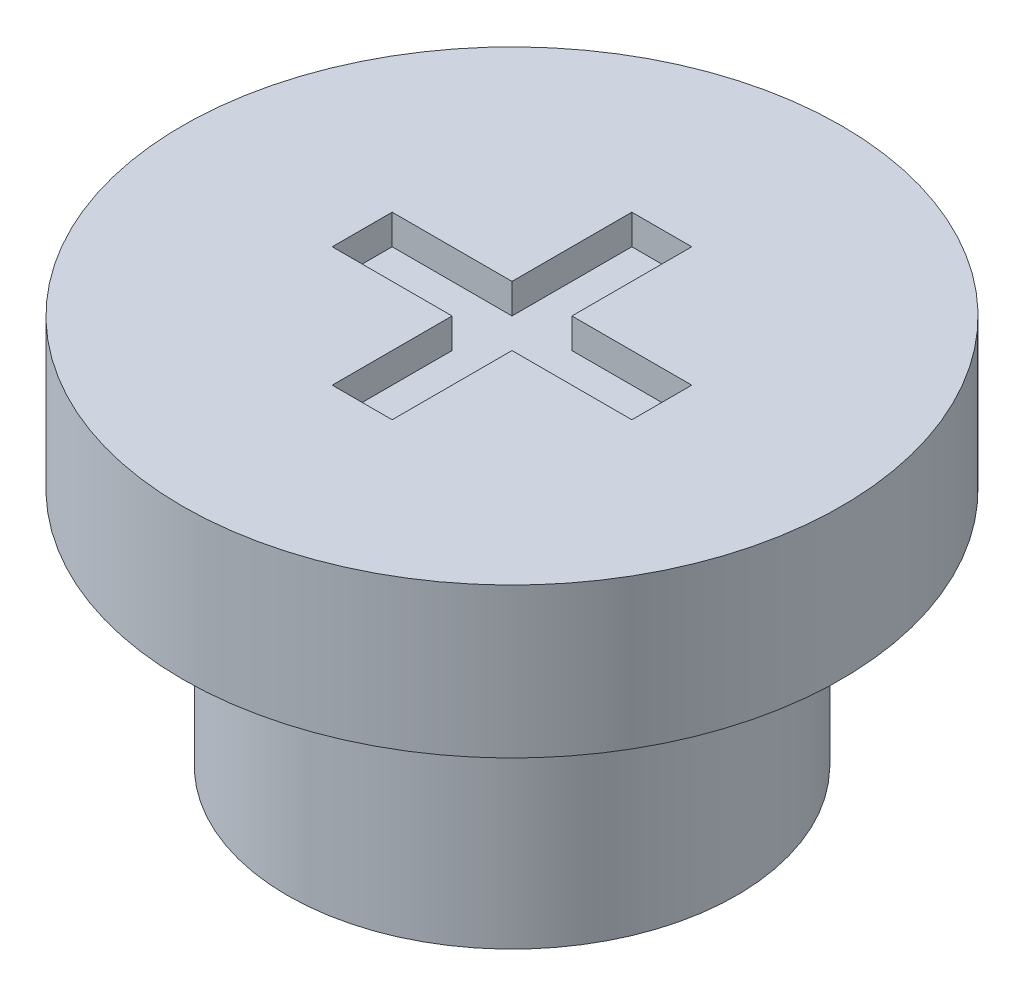
ISO-10303-21;
HEADER;
FILE_DESCRIPTION(('STEP AP214'),'2;1');
FILE_NAME('part.step','',(''),(''),'','','');
FILE_SCHEMA(('AUTOMOTIVE_DESIGN { 1 0 10303 214 1 1 1 1 }'));
ENDSEC;
DATA;
#1=APPLICATION_CONTEXT('core data for automotive mechanical design processes');
#2=APPLICATION_PROTOCOL_DEFINITION('international standard','automotive_design',2000,#1);
#3=PRODUCT_CONTEXT('',#1,'mechanical');
#4=PRODUCT('Part','Part','',(#3));
#5=PRODUCT_RELATED_PRODUCT_CATEGORY('part','',(#4));
#6=PRODUCT_DEFINITION_FORMATION('','',#4);
#7=PRODUCT_DEFINITION_CONTEXT('part definition',#1,'design');
#8=PRODUCT_DEFINITION('design','',#6,#7);
#9=PRODUCT_DEFINITION_SHAPE('','',#8);
#10=(LENGTH_UNIT() NAMED_UNIT(*) SI_UNIT(.MILLI.,.METRE.));
#11=(NAMED_UNIT(*) PLANE_ANGLE_UNIT() SI_UNIT($,.RADIAN.));
#12=(NAMED_UNIT(*) SI_UNIT($,.STERADIAN.) SOLID_ANGLE_UNIT());
#13=UNCERTAINTY_MEASURE_WITH_UNIT(LENGTH_MEASURE(1.E-05),#10,'distance_accuracy_value','');
#14=(GEOMETRIC_REPRESENTATION_CONTEXT(3) GLOBAL_UNCERTAINTY_ASSIGNED_CONTEXT((#13)) GLOBAL_UNIT_ASSIGNED_CONTEXT((#10,
#11,#12)) REPRESENTATION_CONTEXT('',''));
#15=CARTESIAN_POINT('',(0.,0.,0.));
#16=DIRECTION('',(0.,0.,1.));
#17=DIRECTION('',(1.,0.,0.));
#18=AXIS2_PLACEMENT_3D('',#15,#16,#17);
#19=CARTESIAN_POINT('',(0.,0.8,0.));
#20=DIRECTION('',(0.,-1.,0.));
#21=DIRECTION('',(0.,0.,-1.));
#22=AXIS2_PLACEMENT_3D('',#19,#20,#21);
#23=CYLINDRICAL_SURFACE('',#22,0.75);
#24=CARTESIAN_POINT('',(0.,0.8,0.));
#25=DIRECTION('',(0.,1.,0.));
#26=DIRECTION('',(0.,0.,1.));
#27=AXIS2_PLACEMENT_3D('',#24,#25,#26);
#28=CIRCLE('',#27,0.75);
#29=CARTESIAN_POINT('',(0.,0.8,0.75));
#30=VERTEX_POINT('',#29);
#31=EDGE_CURVE('E11',#30,#30,#28,.T.);
#32=ORIENTED_EDGE('',*,*,#31,.F.);
#33=EDGE_LOOP('',(#32));
#34=FACE_BOUND('',#33,.T.);
#35=CARTESIAN_POINT('',(0.,0.,0.));
#36=DIRECTION('',(0.,1.,0.));
#37=DIRECTION('',(0.,0.,1.));
#38=AXIS2_PLACEMENT_3D('',#35,#36,#37);
#39=CIRCLE('',#38,0.75);
#40=CARTESIAN_POINT('',(0.,0.,0.75));
#41=VERTEX_POINT('',#40);
#42=EDGE_CURVE('E45',#41,#41,#39,.T.);
#43=ORIENTED_EDGE('',*,*,#42,.T.);
#44=EDGE_LOOP('',(#43));
#45=FACE_BOUND('',#44,.T.);
#46=ADVANCED_FACE('F39',(#34,#45),#23,.T.);
#47=CARTESIAN_POINT('',(0.,0.,0.));
#48=DIRECTION('',(0.,1.,0.));
#49=DIRECTION('',(0.,0.,1.));
#50=AXIS2_PLACEMENT_3D('',#47,#48,#49);
#51=PLANE('',#50);
#52=ORIENTED_EDGE('',*,*,#42,.F.);
#53=EDGE_LOOP('',(#52));
#54=FACE_BOUND('',#53,.T.);
#55=ADVANCED_FACE('F240',(#54),#51,.F.);
#56=CARTESIAN_POINT('',(0.,1.3,0.));
#57=DIRECTION('',(0.,-1.,0.));
#58=DIRECTION('',(0.,0.,-1.));
#59=AXIS2_PLACEMENT_3D('',#56,#57,#58);
#60=CYLINDRICAL_SURFACE('',#59,1.1);
#61=CARTESIAN_POINT('',(0.,1.3,0.));
#62=DIRECTION('',(0.,1.,0.));
#63=DIRECTION('',(0.,0.,1.));
#64=AXIS2_PLACEMENT_3D('',#61,#62,#63);
#65=CIRCLE('',#64,1.1);
#66=CARTESIAN_POINT('',(0.,1.3,1.1));
#67=VERTEX_POINT('',#66);
#68=EDGE_CURVE('E215',#67,#67,#65,.T.);
#69=ORIENTED_EDGE('',*,*,#68,.F.);
#70=EDGE_LOOP('',(#69));
#71=FACE_BOUND('',#70,.T.);
#72=CARTESIAN_POINT('',(0.,0.8,0.));
#73=DIRECTION('',(0.,1.,0.));
#74=DIRECTION('',(0.,0.,1.));
#75=AXIS2_PLACEMENT_3D('',#72,#73,#74);
#76=CIRCLE('',#75,1.1);
#77=CARTESIAN_POINT('',(0.,0.8,1.1));
#78=VERTEX_POINT('',#77);
#79=EDGE_CURVE('E191',#78,#78,#76,.T.);
#80=ORIENTED_EDGE('',*,*,#79,.T.);
#81=EDGE_LOOP('',(#80));
#82=FACE_BOUND('',#81,.T.);
#83=ADVANCED_FACE('F217',(#71,#82),#60,.T.);
#84=CARTESIAN_POINT('',(0.,1.3,0.));
#85=DIRECTION('',(0.,1.,0.));
#86=DIRECTION('',(0.,0.,1.));
#87=AXIS2_PLACEMENT_3D('',#84,#85,#86);
#88=PLANE('',#87);
#89=DIRECTION('',(0.,0.,1.));
#90=VECTOR('',#89,1.);
#91=CARTESIAN_POINT('',(-0.5,1.3,-0.1));
#92=LINE('',#91,#90);
#93=CARTESIAN_POINT('',(-0.5,1.3,-0.1));
#94=VERTEX_POINT('',#93);
#95=CARTESIAN_POINT('',(-0.5,1.3,0.1));
#96=VERTEX_POINT('',#95);
#97=EDGE_CURVE('E52',#94,#96,#92,.T.);
#98=ORIENTED_EDGE('',*,*,#97,.F.);
#99=DIRECTION('',(-1.,0.,0.));
#100=VECTOR('',#99,1.);
#101=CARTESIAN_POINT('',(-0.5,1.3,-0.1));
#102=LINE('',#101,#100);
#103=CARTESIAN_POINT('',(-0.1,1.3,-0.1));
#104=VERTEX_POINT('',#103);
#105=EDGE_CURVE('E189',#104,#94,#102,.T.);
#106=ORIENTED_EDGE('',*,*,#105,.F.);
#107=DIRECTION('',(0.,0.,1.));
#108=VECTOR('',#107,1.);
#109=CARTESIAN_POINT('',(-0.1,1.3,-0.5));
#110=LINE('',#109,#108);
#111=CARTESIAN_POINT('',(-0.1,1.3,-0.5));
#112=VERTEX_POINT('',#111);
#113=EDGE_CURVE('E187',#112,#104,#110,.T.);
#114=ORIENTED_EDGE('',*,*,#113,.F.);
#115=DIRECTION('',(-1.,0.,0.));
#116=VECTOR('',#115,1.);
#117=CARTESIAN_POINT('',(-0.1,1.3,-0.5));
#118=LINE('',#117,#116);
#119=CARTESIAN_POINT('',(0.0999999999999999,1.3,-0.5));
#120=VERTEX_POINT('',#119);
#121=EDGE_CURVE('E139',#120,#112,#118,.T.);
#122=ORIENTED_EDGE('',*,*,#121,.F.);
#123=DIRECTION('',(0.,0.,-1.));
#124=VECTOR('',#123,1.);
#125=CARTESIAN_POINT('',(0.0999999999999999,1.3,-0.5));
#126=LINE('',#125,#124);
#127=CARTESIAN_POINT('',(0.1,1.3,-0.1));
#128=VERTEX_POINT('',#127);
#129=EDGE_CURVE('E184',#128,#120,#126,.T.);
#130=ORIENTED_EDGE('',*,*,#129,.F.);
#131=DIRECTION('',(-1.,0.,0.));
#132=VECTOR('',#131,1.);
#133=CARTESIAN_POINT('',(0.1,1.3,-0.1));
#134=LINE('',#133,#132);
#135=CARTESIAN_POINT('',(0.5,1.3,-0.1));
#136=VERTEX_POINT('',#135);
#137=EDGE_CURVE('E182',#136,#128,#134,.T.);
#138=ORIENTED_EDGE('',*,*,#137,.F.);
#139=DIRECTION('',(0.,0.,-1.));
#140=VECTOR('',#139,1.);
#141=CARTESIAN_POINT('',(0.5,1.3,-0.1));
#142=LINE('',#141,#140);
#143=CARTESIAN_POINT('',(0.5,1.3,0.1));
#144=VERTEX_POINT('',#143);
#145=EDGE_CURVE('E180',#144,#136,#142,.T.);
#146=ORIENTED_EDGE('',*,*,#145,.F.);
#147=DIRECTION('',(1.,0.,0.));
#148=VECTOR('',#147,1.);
#149=CARTESIAN_POINT('',(0.1,1.3,0.1));
#150=LINE('',#149,#148);
#151=CARTESIAN_POINT('',(0.1,1.3,0.1));
#152=VERTEX_POINT('',#151);
#153=EDGE_CURVE('E174',#152,#144,#150,.T.);
#154=ORIENTED_EDGE('',*,*,#153,.F.);
#155=DIRECTION('',(0.,0.,-1.));
#156=VECTOR('',#155,1.);
#157=CARTESIAN_POINT('',(0.1,1.3,0.1));
#158=LINE('',#157,#156);
#159=CARTESIAN_POINT('',(0.1,1.3,0.5));
#160=VERTEX_POINT('',#159);
#161=EDGE_CURVE('E175',#160,#152,#158,.T.);
#162=ORIENTED_EDGE('',*,*,#161,.F.);
#163=DIRECTION('',(1.,0.,0.));
#164=VECTOR('',#163,1.);
#165=CARTESIAN_POINT('',(-0.1,1.3,0.5));
#166=LINE('',#165,#164);
#167=CARTESIAN_POINT('',(-0.1,1.3,0.5));
#168=VERTEX_POINT('',#167);
#169=EDGE_CURVE('E166',#168,#160,#166,.T.);
#170=ORIENTED_EDGE('',*,*,#169,.F.);
#171=DIRECTION('',(0.,0.,1.));
#172=VECTOR('',#171,1.);
#173=CARTESIAN_POINT('',(-0.1,1.3,0.1));
#174=LINE('',#173,#172);
#175=CARTESIAN_POINT('',(-0.1,1.3,0.1));
#176=VERTEX_POINT('',#175);
#177=EDGE_CURVE('E167',#176,#168,#174,.T.);
#178=ORIENTED_EDGE('',*,*,#177,.F.);
#179=DIRECTION('',(1.,0.,0.));
#180=VECTOR('',#179,1.);
#181=CARTESIAN_POINT('',(-0.5,1.3,0.1));
#182=LINE('',#181,#180);
#183=EDGE_CURVE('E162',#96,#176,#182,.T.);
#184=ORIENTED_EDGE('',*,*,#183,.F.);
#185=EDGE_LOOP('',(#98,#106,#114,#122,#130,#138,#146,#154,#162,#170,#178,#184));
#186=FACE_BOUND('',#185,.T.);
#187=ORIENTED_EDGE('',*,*,#68,.T.);
#188=EDGE_LOOP('',(#187));
#189=FACE_BOUND('',#188,.T.);
#190=ADVANCED_FACE('F224',(#186,#189),#88,.T.);
#191=CARTESIAN_POINT('',(0.,0.8,0.));
#192=DIRECTION('',(0.,1.,0.));
#193=DIRECTION('',(0.,0.,1.));
#194=AXIS2_PLACEMENT_3D('',#191,#192,#193);
#195=PLANE('',#194);
#196=ORIENTED_EDGE('',*,*,#31,.T.);
#197=EDGE_LOOP('',(#196));
#198=FACE_BOUND('',#197,.T.);
#199=ORIENTED_EDGE('',*,*,#79,.F.);
#200=EDGE_LOOP('',(#199));
#201=FACE_BOUND('',#200,.T.);
#202=ADVANCED_FACE('F219',(#198,#201),#195,.F.);
#203=CARTESIAN_POINT('',(-0.5,1.2,-0.1));
#204=DIRECTION('',(-1.,0.,0.));
#205=DIRECTION('',(0.,0.,1.));
#206=AXIS2_PLACEMENT_3D('',#203,#204,#205);
#207=PLANE('',#206);
#208=ORIENTED_EDGE('',*,*,#97,.T.);
#209=DIRECTION('',(0.,1.,0.));
#210=VECTOR('',#209,1.);
#211=CARTESIAN_POINT('',(-0.5,1.2,0.1));
#212=LINE('',#211,#210);
#213=CARTESIAN_POINT('',(-0.5,1.2,0.1));
#214=VERTEX_POINT('',#213);
#215=EDGE_CURVE('E101',#214,#96,#212,.T.);
#216=ORIENTED_EDGE('',*,*,#215,.F.);
#217=DIRECTION('',(0.,0.,1.));
#218=VECTOR('',#217,1.);
#219=CARTESIAN_POINT('',(-0.5,1.2,-0.1));
#220=LINE('',#219,#218);
#221=CARTESIAN_POINT('',(-0.5,1.2,-0.1));
#222=VERTEX_POINT('',#221);
#223=EDGE_CURVE('E194',#222,#214,#220,.T.);
#224=ORIENTED_EDGE('',*,*,#223,.F.);
#225=DIRECTION('',(0.,1.,0.));
#226=VECTOR('',#225,1.);
#227=CARTESIAN_POINT('',(-0.5,1.2,-0.1));
#228=LINE('',#227,#226);
#229=EDGE_CURVE('E61',#222,#94,#228,.T.);
#230=ORIENTED_EDGE('',*,*,#229,.T.);
#231=EDGE_LOOP('',(#208,#216,#224,#230));
#232=FACE_BOUND('',#231,.T.);
#233=ADVANCED_FACE('F225',(#232),#207,.F.);
#234=CARTESIAN_POINT('',(-0.5,1.2,-0.1));
#235=DIRECTION('',(0.,0.,-1.));
#236=DIRECTION('',(-1.,0.,0.));
#237=AXIS2_PLACEMENT_3D('',#234,#235,#236);
#238=PLANE('',#237);
#239=ORIENTED_EDGE('',*,*,#105,.T.);
#240=ORIENTED_EDGE('',*,*,#229,.F.);
#241=DIRECTION('',(-1.,0.,0.));
#242=VECTOR('',#241,1.);
#243=CARTESIAN_POINT('',(-0.5,1.2,-0.1));
#244=LINE('',#243,#242);
#245=CARTESIAN_POINT('',(-0.1,1.2,-0.1));
#246=VERTEX_POINT('',#245);
#247=EDGE_CURVE('E149',#246,#222,#244,.T.);
#248=ORIENTED_EDGE('',*,*,#247,.F.);
#249=DIRECTION('',(0.,1.,0.));
#250=VECTOR('',#249,1.);
#251=CARTESIAN_POINT('',(-0.1,1.2,-0.1));
#252=LINE('',#251,#250);
#253=EDGE_CURVE('E143',#246,#104,#252,.T.);
#254=ORIENTED_EDGE('',*,*,#253,.T.);
#255=EDGE_LOOP('',(#239,#240,#248,#254));
#256=FACE_BOUND('',#255,.T.);
#257=ADVANCED_FACE('F232',(#256),#238,.F.);
#258=CARTESIAN_POINT('',(-0.1,1.2,-0.5));
#259=DIRECTION('',(-1.,0.,0.));
#260=DIRECTION('',(0.,0.,1.));
#261=AXIS2_PLACEMENT_3D('',#258,#259,#260);
#262=PLANE('',#261);
#263=ORIENTED_EDGE('',*,*,#113,.T.);
#264=ORIENTED_EDGE('',*,*,#253,.F.);
#265=DIRECTION('',(0.,0.,1.));
#266=VECTOR('',#265,1.);
#267=CARTESIAN_POINT('',(-0.1,1.2,-0.5));
#268=LINE('',#267,#266);
#269=CARTESIAN_POINT('',(-0.1,1.2,-0.5));
#270=VERTEX_POINT('',#269);
#271=EDGE_CURVE('E144',#270,#246,#268,.T.);
#272=ORIENTED_EDGE('',*,*,#271,.F.);
#273=DIRECTION('',(0.,1.,0.));
#274=VECTOR('',#273,1.);
#275=CARTESIAN_POINT('',(-0.1,1.2,-0.5));
#276=LINE('',#275,#274);
#277=EDGE_CURVE('E128',#270,#112,#276,.T.);
#278=ORIENTED_EDGE('',*,*,#277,.T.);
#279=EDGE_LOOP('',(#263,#264,#272,#278));
#280=FACE_BOUND('',#279,.T.);
#281=ADVANCED_FACE('F148',(#280),#262,.F.);
#282=CARTESIAN_POINT('',(-0.1,1.2,-0.5));
#283=DIRECTION('',(0.,0.,-1.));
#284=DIRECTION('',(-1.,0.,0.));
#285=AXIS2_PLACEMENT_3D('',#282,#283,#284);
#286=PLANE('',#285);
#287=ORIENTED_EDGE('',*,*,#121,.T.);
#288=ORIENTED_EDGE('',*,*,#277,.F.);
#289=DIRECTION('',(-1.,0.,0.));
#290=VECTOR('',#289,1.);
#291=CARTESIAN_POINT('',(-0.1,1.2,-0.5));
#292=LINE('',#291,#290);
#293=CARTESIAN_POINT('',(0.0999999999999999,1.2,-0.5));
#294=VERTEX_POINT('',#293);
#295=EDGE_CURVE('E133',#294,#270,#292,.T.);
#296=ORIENTED_EDGE('',*,*,#295,.F.);
#297=DIRECTION('',(0.,1.,0.));
#298=VECTOR('',#297,1.);
#299=CARTESIAN_POINT('',(0.0999999999999999,1.2,-0.5));
#300=LINE('',#299,#298);
#301=EDGE_CURVE('E142',#294,#120,#300,.T.);
#302=ORIENTED_EDGE('',*,*,#301,.T.);
#303=EDGE_LOOP('',(#287,#288,#296,#302));
#304=FACE_BOUND('',#303,.T.);
#305=ADVANCED_FACE('F135',(#304),#286,.F.);
#306=CARTESIAN_POINT('',(0.0999999999999999,1.2,-0.5));
#307=DIRECTION('',(1.,0.,0.));
#308=DIRECTION('',(0.,0.,-1.));
#309=AXIS2_PLACEMENT_3D('',#306,#307,#308);
#310=PLANE('',#309);
#311=ORIENTED_EDGE('',*,*,#129,.T.);
#312=ORIENTED_EDGE('',*,*,#301,.F.);
#313=DIRECTION('',(0.,0.,-1.));
#314=VECTOR('',#313,1.);
#315=CARTESIAN_POINT('',(0.0999999999999999,1.2,-0.5));
#316=LINE('',#315,#314);
#317=CARTESIAN_POINT('',(0.1,1.2,-0.1));
#318=VERTEX_POINT('',#317);
#319=EDGE_CURVE('E154',#318,#294,#316,.T.);
#320=ORIENTED_EDGE('',*,*,#319,.F.);
#321=DIRECTION('',(0.,1.,0.));
#322=VECTOR('',#321,1.);
#323=CARTESIAN_POINT('',(0.1,1.2,-0.1));
#324=LINE('',#323,#322);
#325=EDGE_CURVE('E197',#318,#128,#324,.T.);
#326=ORIENTED_EDGE('',*,*,#325,.T.);
#327=EDGE_LOOP('',(#311,#312,#320,#326));
#328=FACE_BOUND('',#327,.T.);
#329=ADVANCED_FACE('F298',(#328),#310,.F.);
#330=CARTESIAN_POINT('',(0.1,1.2,-0.1));
#331=DIRECTION('',(0.,0.,-1.));
#332=DIRECTION('',(-1.,0.,0.));
#333=AXIS2_PLACEMENT_3D('',#330,#331,#332);
#334=PLANE('',#333);
#335=ORIENTED_EDGE('',*,*,#137,.T.);
#336=ORIENTED_EDGE('',*,*,#325,.F.);
#337=DIRECTION('',(-1.,0.,0.));
#338=VECTOR('',#337,1.);
#339=CARTESIAN_POINT('',(0.1,1.2,-0.1));
#340=LINE('',#339,#338);
#341=CARTESIAN_POINT('',(0.5,1.2,-0.1));
#342=VERTEX_POINT('',#341);
#343=EDGE_CURVE('E160',#342,#318,#340,.T.);
#344=ORIENTED_EDGE('',*,*,#343,.F.);
#345=DIRECTION('',(0.,1.,0.));
#346=VECTOR('',#345,1.);
#347=CARTESIAN_POINT('',(0.5,1.2,-0.1));
#348=LINE('',#347,#346);
#349=EDGE_CURVE('E200',#342,#136,#348,.T.);
#350=ORIENTED_EDGE('',*,*,#349,.T.);
#351=EDGE_LOOP('',(#335,#336,#344,#350));
#352=FACE_BOUND('',#351,.T.);
#353=ADVANCED_FACE('F306',(#352),#334,.F.);
#354=CARTESIAN_POINT('',(0.5,1.2,-0.1));
#355=DIRECTION('',(1.,0.,0.));
#356=DIRECTION('',(0.,0.,-1.));
#357=AXIS2_PLACEMENT_3D('',#354,#355,#356);
#358=PLANE('',#357);
#359=ORIENTED_EDGE('',*,*,#145,.T.);
#360=ORIENTED_EDGE('',*,*,#349,.F.);
#361=DIRECTION('',(0.,0.,-1.));
#362=VECTOR('',#361,1.);
#363=CARTESIAN_POINT('',(0.5,1.2,-0.1));
#364=LINE('',#363,#362);
#365=CARTESIAN_POINT('',(0.5,1.2,0.1));
#366=VERTEX_POINT('',#365);
#367=EDGE_CURVE('E414',#366,#342,#364,.T.);
#368=ORIENTED_EDGE('',*,*,#367,.F.);
#369=DIRECTION('',(0.,1.,0.));
#370=VECTOR('',#369,1.);
#371=CARTESIAN_POINT('',(0.5,1.2,0.1));
#372=LINE('',#371,#370);
#373=EDGE_CURVE('E203',#366,#144,#372,.T.);
#374=ORIENTED_EDGE('',*,*,#373,.T.);
#375=EDGE_LOOP('',(#359,#360,#368,#374));
#376=FACE_BOUND('',#375,.T.);
#377=ADVANCED_FACE('F318',(#376),#358,.F.);
#378=CARTESIAN_POINT('',(0.1,1.2,0.1));
#379=DIRECTION('',(0.,0.,1.));
#380=DIRECTION('',(1.,0.,0.));
#381=AXIS2_PLACEMENT_3D('',#378,#379,#380);
#382=PLANE('',#381);
#383=ORIENTED_EDGE('',*,*,#153,.T.);
#384=ORIENTED_EDGE('',*,*,#373,.F.);
#385=DIRECTION('',(1.,0.,0.));
#386=VECTOR('',#385,1.);
#387=CARTESIAN_POINT('',(0.1,1.2,0.1));
#388=LINE('',#387,#386);
#389=CARTESIAN_POINT('',(0.1,1.2,0.1));
#390=VERTEX_POINT('',#389);
#391=EDGE_CURVE('E408',#390,#366,#388,.T.);
#392=ORIENTED_EDGE('',*,*,#391,.F.);
#393=DIRECTION('',(0.,1.,0.));
#394=VECTOR('',#393,1.);
#395=CARTESIAN_POINT('',(0.1,1.2,0.1));
#396=LINE('',#395,#394);
#397=EDGE_CURVE('E201',#390,#152,#396,.T.);
#398=ORIENTED_EDGE('',*,*,#397,.T.);
#399=EDGE_LOOP('',(#383,#384,#392,#398));
#400=FACE_BOUND('',#399,.T.);
#401=ADVANCED_FACE('F327',(#400),#382,.F.);
#402=CARTESIAN_POINT('',(0.1,1.2,0.1));
#403=DIRECTION('',(1.,0.,0.));
#404=DIRECTION('',(0.,0.,-1.));
#405=AXIS2_PLACEMENT_3D('',#402,#403,#404);
#406=PLANE('',#405);
#407=ORIENTED_EDGE('',*,*,#161,.T.);
#408=ORIENTED_EDGE('',*,*,#397,.F.);
#409=DIRECTION('',(0.,0.,-1.));
#410=VECTOR('',#409,1.);
#411=CARTESIAN_POINT('',(0.1,1.2,0.1));
#412=LINE('',#411,#410);
#413=CARTESIAN_POINT('',(0.1,1.2,0.5));
#414=VERTEX_POINT('',#413);
#415=EDGE_CURVE('E406',#414,#390,#412,.T.);
#416=ORIENTED_EDGE('',*,*,#415,.F.);
#417=DIRECTION('',(0.,1.,0.));
#418=VECTOR('',#417,1.);
#419=CARTESIAN_POINT('',(0.1,1.2,0.5));
#420=LINE('',#419,#418);
#421=EDGE_CURVE('E202',#414,#160,#420,.T.);
#422=ORIENTED_EDGE('',*,*,#421,.T.);
#423=EDGE_LOOP('',(#407,#408,#416,#422));
#424=FACE_BOUND('',#423,.T.);
#425=ADVANCED_FACE('F337',(#424),#406,.F.);
#426=CARTESIAN_POINT('',(-0.1,1.2,0.5));
#427=DIRECTION('',(0.,0.,1.));
#428=DIRECTION('',(1.,0.,0.));
#429=AXIS2_PLACEMENT_3D('',#426,#427,#428);
#430=PLANE('',#429);
#431=ORIENTED_EDGE('',*,*,#169,.T.);
#432=ORIENTED_EDGE('',*,*,#421,.F.);
#433=DIRECTION('',(1.,0.,0.));
#434=VECTOR('',#433,1.);
#435=CARTESIAN_POINT('',(-0.1,1.2,0.5));
#436=LINE('',#435,#434);
#437=CARTESIAN_POINT('',(-0.1,1.2,0.5));
#438=VERTEX_POINT('',#437);
#439=EDGE_CURVE('E396',#438,#414,#436,.T.);
#440=ORIENTED_EDGE('',*,*,#439,.F.);
#441=DIRECTION('',(0.,1.,0.));
#442=VECTOR('',#441,1.);
#443=CARTESIAN_POINT('',(-0.1,1.2,0.5));
#444=LINE('',#443,#442);
#445=EDGE_CURVE('E210',#438,#168,#444,.T.);
#446=ORIENTED_EDGE('',*,*,#445,.T.);
#447=EDGE_LOOP('',(#431,#432,#440,#446));
#448=FACE_BOUND('',#447,.T.);
#449=ADVANCED_FACE('F346',(#448),#430,.F.);
#450=CARTESIAN_POINT('',(-0.1,1.2,0.1));
#451=DIRECTION('',(-1.,0.,0.));
#452=DIRECTION('',(0.,0.,1.));
#453=AXIS2_PLACEMENT_3D('',#450,#451,#452);
#454=PLANE('',#453);
#455=ORIENTED_EDGE('',*,*,#177,.T.);
#456=ORIENTED_EDGE('',*,*,#445,.F.);
#457=DIRECTION('',(0.,0.,1.));
#458=VECTOR('',#457,1.);
#459=CARTESIAN_POINT('',(-0.1,1.2,0.1));
#460=LINE('',#459,#458);
#461=CARTESIAN_POINT('',(-0.1,1.2,0.1));
#462=VERTEX_POINT('',#461);
#463=EDGE_CURVE('E397',#462,#438,#460,.T.);
#464=ORIENTED_EDGE('',*,*,#463,.F.);
#465=DIRECTION('',(0.,1.,0.));
#466=VECTOR('',#465,1.);
#467=CARTESIAN_POINT('',(-0.1,1.2,0.1));
#468=LINE('',#467,#466);
#469=EDGE_CURVE('E207',#462,#176,#468,.T.);
#470=ORIENTED_EDGE('',*,*,#469,.T.);
#471=EDGE_LOOP('',(#455,#456,#464,#470));
#472=FACE_BOUND('',#471,.T.);
#473=ADVANCED_FACE('F360',(#472),#454,.F.);
#474=CARTESIAN_POINT('',(-0.5,1.2,0.1));
#475=DIRECTION('',(0.,0.,1.));
#476=DIRECTION('',(1.,0.,0.));
#477=AXIS2_PLACEMENT_3D('',#474,#475,#476);
#478=PLANE('',#477);
#479=ORIENTED_EDGE('',*,*,#183,.T.);
#480=ORIENTED_EDGE('',*,*,#469,.F.);
#481=DIRECTION('',(1.,0.,0.));
#482=VECTOR('',#481,1.);
#483=CARTESIAN_POINT('',(-0.5,1.2,0.1));
#484=LINE('',#483,#482);
#485=EDGE_CURVE('E398',#214,#462,#484,.T.);
#486=ORIENTED_EDGE('',*,*,#485,.F.);
#487=ORIENTED_EDGE('',*,*,#215,.T.);
#488=EDGE_LOOP('',(#479,#480,#486,#487));
#489=FACE_BOUND('',#488,.T.);
#490=ADVANCED_FACE('F366',(#489),#478,.F.);
#491=CARTESIAN_POINT('',(0.,1.2,0.));
#492=DIRECTION('',(0.,1.,0.));
#493=DIRECTION('',(0.,0.,1.));
#494=AXIS2_PLACEMENT_3D('',#491,#492,#493);
#495=PLANE('',#494);
#496=ORIENTED_EDGE('',*,*,#223,.T.);
#497=ORIENTED_EDGE('',*,*,#485,.T.);
#498=ORIENTED_EDGE('',*,*,#463,.T.);
#499=ORIENTED_EDGE('',*,*,#439,.T.);
#500=ORIENTED_EDGE('',*,*,#415,.T.);
#501=ORIENTED_EDGE('',*,*,#391,.T.);
#502=ORIENTED_EDGE('',*,*,#367,.T.);
#503=ORIENTED_EDGE('',*,*,#343,.T.);
#504=ORIENTED_EDGE('',*,*,#319,.T.);
#505=ORIENTED_EDGE('',*,*,#295,.T.);
#506=ORIENTED_EDGE('',*,*,#271,.T.);
#507=ORIENTED_EDGE('',*,*,#247,.T.);
#508=EDGE_LOOP('',(#496,#497,#498,#499,#500,#501,#502,#503,#504,#505,#506,#507));
#509=FACE_BOUND('',#508,.T.);
#510=ADVANCED_FACE('F155',(#509),#495,.T.);
#511=CLOSED_SHELL('',(#46,#55,#83,#190,#202,#233,#257,#281,#305,#329,#353,#377,#401,#425,#449,
#473,#490,#510));
#512=MANIFOLD_SOLID_BREP('B2',#511);
#513=ADVANCED_BREP_SHAPE_REPRESENTATION('',(#18,#512),#14);
#514=SHAPE_DEFINITION_REPRESENTATION(#9,#513);
ENDSEC;
END-ISO-10303-21;
